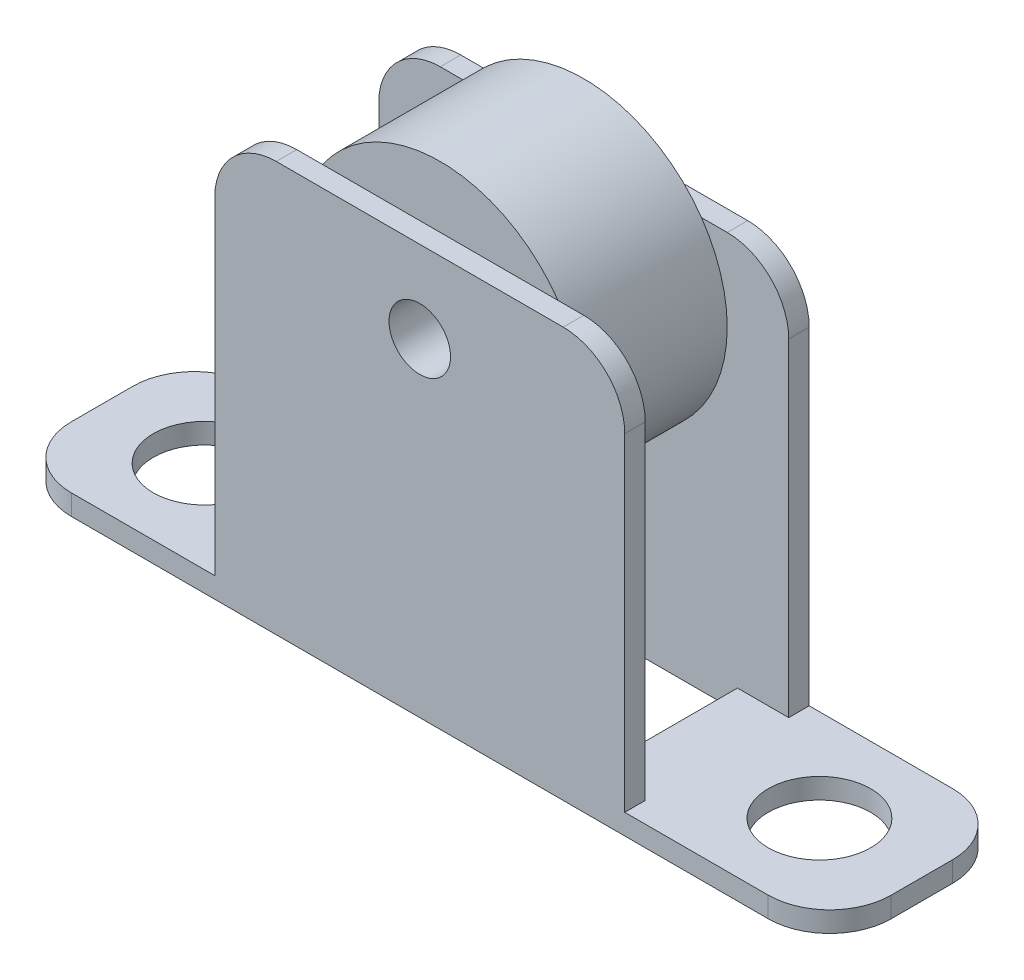
ISO-10303-21;
HEADER;
FILE_DESCRIPTION(('STEP AP214'),'2;1');
FILE_NAME('part.step','',(''),(''),'','','');
FILE_SCHEMA(('AUTOMOTIVE_DESIGN { 1 0 10303 214 1 1 1 1 }'));
ENDSEC;
DATA;
#1=APPLICATION_CONTEXT('core data for automotive mechanical design processes');
#2=APPLICATION_PROTOCOL_DEFINITION('international standard','automotive_design',2000,#1);
#3=PRODUCT_CONTEXT('',#1,'mechanical');
#4=PRODUCT('Part','Part','',(#3));
#5=PRODUCT_RELATED_PRODUCT_CATEGORY('part','',(#4));
#6=PRODUCT_DEFINITION_FORMATION('','',#4);
#7=PRODUCT_DEFINITION_CONTEXT('part definition',#1,'design');
#8=PRODUCT_DEFINITION('design','',#6,#7);
#9=PRODUCT_DEFINITION_SHAPE('','',#8);
#10=(LENGTH_UNIT() NAMED_UNIT(*) SI_UNIT(.MILLI.,.METRE.));
#11=(NAMED_UNIT(*) PLANE_ANGLE_UNIT() SI_UNIT($,.RADIAN.));
#12=(NAMED_UNIT(*) SI_UNIT($,.STERADIAN.) SOLID_ANGLE_UNIT());
#13=UNCERTAINTY_MEASURE_WITH_UNIT(LENGTH_MEASURE(1.E-05),#10,'distance_accuracy_value','');
#14=(GEOMETRIC_REPRESENTATION_CONTEXT(3) GLOBAL_UNCERTAINTY_ASSIGNED_CONTEXT((#13)) GLOBAL_UNIT_ASSIGNED_CONTEXT((#10,
#11,#12)) REPRESENTATION_CONTEXT('',''));
#15=CARTESIAN_POINT('',(0.,0.,0.));
#16=DIRECTION('',(0.,0.,1.));
#17=DIRECTION('',(1.,0.,0.));
#18=AXIS2_PLACEMENT_3D('',#15,#16,#17);
#19=CARTESIAN_POINT('',(12.5,1.,-0.999999999999999));
#20=DIRECTION('',(0.,0.,-1.));
#21=DIRECTION('',(-1.,0.,0.));
#22=AXIS2_PLACEMENT_3D('',#19,#20,#21);
#23=PLANE('',#22);
#24=DIRECTION('',(-1.,0.,0.));
#25=VECTOR('',#24,1.);
#26=CARTESIAN_POINT('',(10.,20.,-1.));
#27=LINE('',#26,#25);
#28=CARTESIAN_POINT('',(27.,20.,-1.));
#29=VERTEX_POINT('',#28);
#30=CARTESIAN_POINT('',(25.744562646538,20.,-1.));
#31=VERTEX_POINT('',#30);
#32=EDGE_CURVE('E290',#29,#31,#27,.T.);
#33=ORIENTED_EDGE('',*,*,#32,.F.);
#34=CARTESIAN_POINT('',(27.,17.,-0.999999999999999));
#35=DIRECTION('',(0.,0.,-1.));
#36=DIRECTION('',(-1.,0.,0.));
#37=AXIS2_PLACEMENT_3D('',#34,#35,#36);
#38=CIRCLE('',#37,3.);
#39=CARTESIAN_POINT('',(30.,17.,-1.));
#40=VERTEX_POINT('',#39);
#41=EDGE_CURVE('E412',#29,#40,#38,.T.);
#42=ORIENTED_EDGE('',*,*,#41,.T.);
#43=DIRECTION('',(0.,1.,0.));
#44=VECTOR('',#43,1.);
#45=CARTESIAN_POINT('',(30.,0.,-1.));
#46=LINE('',#45,#44);
#47=CARTESIAN_POINT('',(30.,1.,-1.));
#48=VERTEX_POINT('',#47);
#49=EDGE_CURVE('E284',#48,#40,#46,.T.);
#50=ORIENTED_EDGE('',*,*,#49,.F.);
#51=DIRECTION('',(1.,0.,0.));
#52=VECTOR('',#51,1.);
#53=CARTESIAN_POINT('',(0.,1.,-1.));
#54=LINE('',#53,#52);
#55=CARTESIAN_POINT('',(27.5,1.,-0.999999999999999));
#56=VERTEX_POINT('',#55);
#57=EDGE_CURVE('E288',#56,#48,#54,.T.);
#58=ORIENTED_EDGE('',*,*,#57,.F.);
#59=DIRECTION('',(0.,-1.,0.));
#60=VECTOR('',#59,1.);
#61=CARTESIAN_POINT('',(27.5,1.,-0.999999999999999));
#62=LINE('',#61,#60);
#63=CARTESIAN_POINT('',(27.5,0.,-0.999999999999999));
#64=VERTEX_POINT('',#63);
#65=EDGE_CURVE('E327',#56,#64,#62,.T.);
#66=ORIENTED_EDGE('',*,*,#65,.T.);
#67=DIRECTION('',(1.,0.,0.));
#68=VECTOR('',#67,1.);
#69=CARTESIAN_POINT('',(12.5,0.,-0.999999999999999));
#70=LINE('',#69,#68);
#71=CARTESIAN_POINT('',(12.5,0.,-0.999999999999999));
#72=VERTEX_POINT('',#71);
#73=EDGE_CURVE('E316',#72,#64,#70,.T.);
#74=ORIENTED_EDGE('',*,*,#73,.F.);
#75=DIRECTION('',(0.,-1.,0.));
#76=VECTOR('',#75,1.);
#77=CARTESIAN_POINT('',(12.5,1.,-0.999999999999999));
#78=LINE('',#77,#76);
#79=CARTESIAN_POINT('',(12.5,1.,-0.999999999999999));
#80=VERTEX_POINT('',#79);
#81=EDGE_CURVE('E329',#80,#72,#78,.T.);
#82=ORIENTED_EDGE('',*,*,#81,.F.);
#83=CARTESIAN_POINT('',(10.,1.,-1.));
#84=VERTEX_POINT('',#83);
#85=EDGE_CURVE('E300',#84,#80,#54,.T.);
#86=ORIENTED_EDGE('',*,*,#85,.F.);
#87=DIRECTION('',(0.,-1.,0.));
#88=VECTOR('',#87,1.);
#89=CARTESIAN_POINT('',(10.,0.,-1.));
#90=LINE('',#89,#88);
#91=CARTESIAN_POINT('',(10.,17.,-1.));
#92=VERTEX_POINT('',#91);
#93=EDGE_CURVE('E278',#92,#84,#90,.T.);
#94=ORIENTED_EDGE('',*,*,#93,.F.);
#95=CARTESIAN_POINT('',(13.,17.,-0.999999999999999));
#96=DIRECTION('',(0.,0.,-1.));
#97=DIRECTION('',(-1.,0.,0.));
#98=AXIS2_PLACEMENT_3D('',#95,#96,#97);
#99=CIRCLE('',#98,3.);
#100=CARTESIAN_POINT('',(13.,20.,-1.));
#101=VERTEX_POINT('',#100);
#102=EDGE_CURVE('E415',#92,#101,#99,.T.);
#103=ORIENTED_EDGE('',*,*,#102,.T.);
#104=CARTESIAN_POINT('',(14.255437353462,20.,-1.));
#105=VERTEX_POINT('',#104);
#106=EDGE_CURVE('E286',#105,#101,#27,.T.);
#107=ORIENTED_EDGE('',*,*,#106,.F.);
#108=CARTESIAN_POINT('',(20.,16.,-1.));
#109=DIRECTION('',(0.,0.,-1.));
#110=DIRECTION('',(-1.,0.,0.));
#111=AXIS2_PLACEMENT_3D('',#108,#109,#110);
#112=CIRCLE('',#111,7.);
#113=EDGE_CURVE('E245',#31,#105,#112,.T.);
#114=ORIENTED_EDGE('',*,*,#113,.F.);
#115=EDGE_LOOP('',(#33,#42,#50,#58,#66,#74,#82,#86,#94,#103,#107,#114));
#116=FACE_BOUND('',#115,.T.);
#117=ADVANCED_FACE('F41',(#116),#23,.T.);
#118=CARTESIAN_POINT('',(12.5,1.,-8.));
#119=DIRECTION('',(0.,0.,1.));
#120=DIRECTION('',(1.,0.,0.));
#121=AXIS2_PLACEMENT_3D('',#118,#119,#120);
#122=PLANE('',#121);
#123=DIRECTION('',(0.,1.,0.));
#124=VECTOR('',#123,1.);
#125=CARTESIAN_POINT('',(30.,1.,-8.));
#126=LINE('',#125,#124);
#127=CARTESIAN_POINT('',(30.,1.,-8.));
#128=VERTEX_POINT('',#127);
#129=CARTESIAN_POINT('',(30.,17.,-8.));
#130=VERTEX_POINT('',#129);
#131=EDGE_CURVE('E227',#128,#130,#126,.T.);
#132=ORIENTED_EDGE('',*,*,#131,.T.);
#133=CARTESIAN_POINT('',(27.,17.,-8.));
#134=DIRECTION('',(0.,0.,1.));
#135=DIRECTION('',(1.,0.,0.));
#136=AXIS2_PLACEMENT_3D('',#133,#134,#135);
#137=CIRCLE('',#136,3.);
#138=CARTESIAN_POINT('',(27.,20.,-8.));
#139=VERTEX_POINT('',#138);
#140=EDGE_CURVE('E421',#130,#139,#137,.T.);
#141=ORIENTED_EDGE('',*,*,#140,.T.);
#142=DIRECTION('',(-1.,0.,0.));
#143=VECTOR('',#142,1.);
#144=CARTESIAN_POINT('',(0.,20.,-8.));
#145=LINE('',#144,#143);
#146=CARTESIAN_POINT('',(25.744562646538,20.,-8.));
#147=VERTEX_POINT('',#146);
#148=EDGE_CURVE('E223',#139,#147,#145,.T.);
#149=ORIENTED_EDGE('',*,*,#148,.T.);
#150=CARTESIAN_POINT('',(20.,16.,-8.));
#151=DIRECTION('',(0.,0.,1.));
#152=DIRECTION('',(1.,0.,0.));
#153=AXIS2_PLACEMENT_3D('',#150,#151,#152);
#154=CIRCLE('',#153,7.);
#155=CARTESIAN_POINT('',(14.255437353462,20.,-8.));
#156=VERTEX_POINT('',#155);
#157=EDGE_CURVE('E230',#156,#147,#154,.T.);
#158=ORIENTED_EDGE('',*,*,#157,.F.);
#159=CARTESIAN_POINT('',(13.,20.,-8.));
#160=VERTEX_POINT('',#159);
#161=EDGE_CURVE('E214',#156,#160,#145,.T.);
#162=ORIENTED_EDGE('',*,*,#161,.T.);
#163=CARTESIAN_POINT('',(13.,17.,-8.));
#164=DIRECTION('',(0.,0.,1.));
#165=DIRECTION('',(1.,0.,0.));
#166=AXIS2_PLACEMENT_3D('',#163,#164,#165);
#167=CIRCLE('',#166,3.);
#168=CARTESIAN_POINT('',(10.,17.,-8.));
#169=VERTEX_POINT('',#168);
#170=EDGE_CURVE('E57',#160,#169,#167,.T.);
#171=ORIENTED_EDGE('',*,*,#170,.T.);
#172=DIRECTION('',(0.,-1.,0.));
#173=VECTOR('',#172,1.);
#174=CARTESIAN_POINT('',(10.,1.,-8.));
#175=LINE('',#174,#173);
#176=CARTESIAN_POINT('',(10.,1.,-8.));
#177=VERTEX_POINT('',#176);
#178=EDGE_CURVE('E259',#169,#177,#175,.T.);
#179=ORIENTED_EDGE('',*,*,#178,.T.);
#180=DIRECTION('',(-1.,0.,0.));
#181=VECTOR('',#180,1.);
#182=CARTESIAN_POINT('',(0.,1.,-8.));
#183=LINE('',#182,#181);
#184=CARTESIAN_POINT('',(12.5,1.,-8.));
#185=VERTEX_POINT('',#184);
#186=EDGE_CURVE('E263',#185,#177,#183,.T.);
#187=ORIENTED_EDGE('',*,*,#186,.F.);
#188=DIRECTION('',(0.,-1.,0.));
#189=VECTOR('',#188,1.);
#190=CARTESIAN_POINT('',(12.5,1.,-8.));
#191=LINE('',#190,#189);
#192=CARTESIAN_POINT('',(12.5,0.,-8.));
#193=VERTEX_POINT('',#192);
#194=EDGE_CURVE('E311',#185,#193,#191,.T.);
#195=ORIENTED_EDGE('',*,*,#194,.T.);
#196=DIRECTION('',(-1.,0.,0.));
#197=VECTOR('',#196,1.);
#198=CARTESIAN_POINT('',(12.5,0.,-8.));
#199=LINE('',#198,#197);
#200=CARTESIAN_POINT('',(27.5,0.,-8.));
#201=VERTEX_POINT('',#200);
#202=EDGE_CURVE('E309',#201,#193,#199,.T.);
#203=ORIENTED_EDGE('',*,*,#202,.F.);
#204=DIRECTION('',(0.,-1.,0.));
#205=VECTOR('',#204,1.);
#206=CARTESIAN_POINT('',(27.5,1.,-8.));
#207=LINE('',#206,#205);
#208=CARTESIAN_POINT('',(27.5,1.,-8.));
#209=VERTEX_POINT('',#208);
#210=EDGE_CURVE('E326',#209,#201,#207,.T.);
#211=ORIENTED_EDGE('',*,*,#210,.F.);
#212=EDGE_CURVE('E268',#128,#209,#183,.T.);
#213=ORIENTED_EDGE('',*,*,#212,.F.);
#214=EDGE_LOOP('',(#132,#141,#149,#158,#162,#171,#179,#187,#195,#203,#211,#213));
#215=FACE_BOUND('',#214,.T.);
#216=ADVANCED_FACE('F226',(#215),#122,.T.);
#217=CARTESIAN_POINT('',(0.,1.,0.));
#218=DIRECTION('',(0.,-1.,0.));
#219=DIRECTION('',(0.,0.,-1.));
#220=AXIS2_PLACEMENT_3D('',#217,#218,#219);
#221=PLANE('',#220);
#222=CARTESIAN_POINT('',(5.,1.,-4.5));
#223=DIRECTION('',(0.,1.,0.));
#224=DIRECTION('',(0.,0.,1.));
#225=AXIS2_PLACEMENT_3D('',#222,#223,#224);
#226=CIRCLE('',#225,2.5);
#227=CARTESIAN_POINT('',(5.,1.,-2.));
#228=VERTEX_POINT('',#227);
#229=EDGE_CURVE('E246',#228,#228,#226,.T.);
#230=ORIENTED_EDGE('',*,*,#229,.F.);
#231=EDGE_LOOP('',(#230));
#232=FACE_BOUND('',#231,.T.);
#233=DIRECTION('',(-1.,0.,0.));
#234=VECTOR('',#233,1.);
#235=CARTESIAN_POINT('',(0.,1.,-9.));
#236=LINE('',#235,#234);
#237=CARTESIAN_POINT('',(10.,1.,-9.));
#238=VERTEX_POINT('',#237);
#239=CARTESIAN_POINT('',(3.,1.,-9.));
#240=VERTEX_POINT('',#239);
#241=EDGE_CURVE('E343',#238,#240,#236,.T.);
#242=ORIENTED_EDGE('',*,*,#241,.T.);
#243=CARTESIAN_POINT('',(3.,1.,-6.));
#244=DIRECTION('',(0.,-1.,0.));
#245=DIRECTION('',(0.,0.,-1.));
#246=AXIS2_PLACEMENT_3D('',#243,#244,#245);
#247=CIRCLE('',#246,3.);
#248=CARTESIAN_POINT('',(0.,1.,-6.));
#249=VERTEX_POINT('',#248);
#250=EDGE_CURVE('E401',#240,#249,#247,.F.);
#251=ORIENTED_EDGE('',*,*,#250,.T.);
#252=DIRECTION('',(0.,0.,1.));
#253=VECTOR('',#252,1.);
#254=CARTESIAN_POINT('',(0.,1.,0.));
#255=LINE('',#254,#253);
#256=CARTESIAN_POINT('',(0.,1.,-3.));
#257=VERTEX_POINT('',#256);
#258=EDGE_CURVE('E331',#249,#257,#255,.T.);
#259=ORIENTED_EDGE('',*,*,#258,.T.);
#260=CARTESIAN_POINT('',(3.,1.,-3.));
#261=DIRECTION('',(0.,-1.,0.));
#262=DIRECTION('',(0.,0.,-1.));
#263=AXIS2_PLACEMENT_3D('',#260,#261,#262);
#264=CIRCLE('',#263,3.);
#265=CARTESIAN_POINT('',(3.,1.,0.));
#266=VERTEX_POINT('',#265);
#267=EDGE_CURVE('E402',#257,#266,#264,.F.);
#268=ORIENTED_EDGE('',*,*,#267,.T.);
#269=DIRECTION('',(1.,0.,0.));
#270=VECTOR('',#269,1.);
#271=CARTESIAN_POINT('',(0.,1.,0.));
#272=LINE('',#271,#270);
#273=CARTESIAN_POINT('',(10.,1.,0.));
#274=VERTEX_POINT('',#273);
#275=EDGE_CURVE('E336',#266,#274,#272,.T.);
#276=ORIENTED_EDGE('',*,*,#275,.T.);
#277=DIRECTION('',(0.,0.,-1.));
#278=VECTOR('',#277,1.);
#279=CARTESIAN_POINT('',(10.,1.,0.));
#280=LINE('',#279,#278);
#281=EDGE_CURVE('E301',#274,#84,#280,.T.);
#282=ORIENTED_EDGE('',*,*,#281,.T.);
#283=ORIENTED_EDGE('',*,*,#85,.T.);
#284=DIRECTION('',(0.,0.,1.));
#285=VECTOR('',#284,1.);
#286=CARTESIAN_POINT('',(12.5,1.,-8.));
#287=LINE('',#286,#285);
#288=EDGE_CURVE('E308',#185,#80,#287,.T.);
#289=ORIENTED_EDGE('',*,*,#288,.F.);
#290=ORIENTED_EDGE('',*,*,#186,.T.);
#291=DIRECTION('',(0.,0.,1.));
#292=VECTOR('',#291,1.);
#293=CARTESIAN_POINT('',(10.,1.,0.));
#294=LINE('',#293,#292);
#295=EDGE_CURVE('E272',#238,#177,#294,.T.);
#296=ORIENTED_EDGE('',*,*,#295,.F.);
#297=EDGE_LOOP('',(#242,#251,#259,#268,#276,#282,#283,#289,#290,#296));
#298=FACE_BOUND('',#297,.T.);
#299=ADVANCED_FACE('F442',(#232,#298),#221,.F.);
#300=CARTESIAN_POINT('',(35.,1.,-4.5));
#301=DIRECTION('',(0.,1.,0.));
#302=DIRECTION('',(0.,0.,1.));
#303=AXIS2_PLACEMENT_3D('',#300,#301,#302);
#304=CIRCLE('',#303,2.5);
#305=CARTESIAN_POINT('',(35.,1.,-2.));
#306=VERTEX_POINT('',#305);
#307=EDGE_CURVE('E253',#306,#306,#304,.T.);
#308=ORIENTED_EDGE('',*,*,#307,.F.);
#309=EDGE_LOOP('',(#308));
#310=FACE_BOUND('',#309,.T.);
#311=CARTESIAN_POINT('',(30.,1.,0.));
#312=VERTEX_POINT('',#311);
#313=CARTESIAN_POINT('',(37.,1.,0.));
#314=VERTEX_POINT('',#313);
#315=EDGE_CURVE('E339',#312,#314,#272,.T.);
#316=ORIENTED_EDGE('',*,*,#315,.T.);
#317=CARTESIAN_POINT('',(37.,1.,-3.));
#318=DIRECTION('',(0.,-1.,0.));
#319=DIRECTION('',(0.,0.,-1.));
#320=AXIS2_PLACEMENT_3D('',#317,#318,#319);
#321=CIRCLE('',#320,3.);
#322=CARTESIAN_POINT('',(40.,1.,-3.));
#323=VERTEX_POINT('',#322);
#324=EDGE_CURVE('E384',#314,#323,#321,.F.);
#325=ORIENTED_EDGE('',*,*,#324,.T.);
#326=DIRECTION('',(0.,0.,-1.));
#327=VECTOR('',#326,1.);
#328=CARTESIAN_POINT('',(40.,1.,0.));
#329=LINE('',#328,#327);
#330=CARTESIAN_POINT('',(40.,1.,-6.));
#331=VERTEX_POINT('',#330);
#332=EDGE_CURVE('E341',#323,#331,#329,.T.);
#333=ORIENTED_EDGE('',*,*,#332,.T.);
#334=CARTESIAN_POINT('',(37.,1.,-6.));
#335=DIRECTION('',(0.,-1.,0.));
#336=DIRECTION('',(0.,0.,-1.));
#337=AXIS2_PLACEMENT_3D('',#334,#335,#336);
#338=CIRCLE('',#337,3.);
#339=CARTESIAN_POINT('',(37.,1.,-9.));
#340=VERTEX_POINT('',#339);
#341=EDGE_CURVE('E382',#331,#340,#338,.F.);
#342=ORIENTED_EDGE('',*,*,#341,.T.);
#343=CARTESIAN_POINT('',(30.,1.,-9.));
#344=VERTEX_POINT('',#343);
#345=EDGE_CURVE('E344',#340,#344,#236,.T.);
#346=ORIENTED_EDGE('',*,*,#345,.T.);
#347=DIRECTION('',(0.,0.,-1.));
#348=VECTOR('',#347,1.);
#349=CARTESIAN_POINT('',(30.,1.,0.));
#350=LINE('',#349,#348);
#351=EDGE_CURVE('E269',#128,#344,#350,.T.);
#352=ORIENTED_EDGE('',*,*,#351,.F.);
#353=ORIENTED_EDGE('',*,*,#212,.T.);
#354=DIRECTION('',(0.,0.,-1.));
#355=VECTOR('',#354,1.);
#356=CARTESIAN_POINT('',(27.5,1.,-8.));
#357=LINE('',#356,#355);
#358=EDGE_CURVE('E310',#56,#209,#357,.T.);
#359=ORIENTED_EDGE('',*,*,#358,.F.);
#360=ORIENTED_EDGE('',*,*,#57,.T.);
#361=DIRECTION('',(0.,0.,1.));
#362=VECTOR('',#361,1.);
#363=CARTESIAN_POINT('',(30.,1.,0.));
#364=LINE('',#363,#362);
#365=EDGE_CURVE('E296',#48,#312,#364,.T.);
#366=ORIENTED_EDGE('',*,*,#365,.T.);
#367=EDGE_LOOP('',(#316,#325,#333,#342,#346,#352,#353,#359,#360,#366));
#368=FACE_BOUND('',#367,.T.);
#369=ADVANCED_FACE('F487',(#310,#368),#221,.F.);
#370=CARTESIAN_POINT('',(0.,0.,0.));
#371=DIRECTION('',(0.,-1.,0.));
#372=DIRECTION('',(0.,0.,-1.));
#373=AXIS2_PLACEMENT_3D('',#370,#371,#372);
#374=PLANE('',#373);
#375=CARTESIAN_POINT('',(5.,0.,-4.5));
#376=DIRECTION('',(0.,-1.,0.));
#377=DIRECTION('',(0.,0.,-1.));
#378=AXIS2_PLACEMENT_3D('',#375,#376,#377);
#379=CIRCLE('',#378,2.5);
#380=CARTESIAN_POINT('',(5.,0.,-7.));
#381=VERTEX_POINT('',#380);
#382=EDGE_CURVE('E247',#381,#381,#379,.T.);
#383=ORIENTED_EDGE('',*,*,#382,.F.);
#384=EDGE_LOOP('',(#383));
#385=FACE_BOUND('',#384,.T.);
#386=CARTESIAN_POINT('',(35.,0.,-4.5));
#387=DIRECTION('',(0.,-1.,0.));
#388=DIRECTION('',(0.,0.,-1.));
#389=AXIS2_PLACEMENT_3D('',#386,#387,#388);
#390=CIRCLE('',#389,2.5);
#391=CARTESIAN_POINT('',(35.,0.,-7.));
#392=VERTEX_POINT('',#391);
#393=EDGE_CURVE('E255',#392,#392,#390,.T.);
#394=ORIENTED_EDGE('',*,*,#393,.F.);
#395=EDGE_LOOP('',(#394));
#396=FACE_BOUND('',#395,.T.);
#397=DIRECTION('',(0.,0.,-1.));
#398=VECTOR('',#397,1.);
#399=CARTESIAN_POINT('',(27.5,0.,-8.));
#400=LINE('',#399,#398);
#401=EDGE_CURVE('E317',#64,#201,#400,.T.);
#402=ORIENTED_EDGE('',*,*,#401,.T.);
#403=ORIENTED_EDGE('',*,*,#202,.T.);
#404=DIRECTION('',(0.,0.,1.));
#405=VECTOR('',#404,1.);
#406=CARTESIAN_POINT('',(12.5,0.,-8.));
#407=LINE('',#406,#405);
#408=EDGE_CURVE('E302',#193,#72,#407,.T.);
#409=ORIENTED_EDGE('',*,*,#408,.T.);
#410=ORIENTED_EDGE('',*,*,#73,.T.);
#411=EDGE_LOOP('',(#402,#403,#409,#410));
#412=FACE_BOUND('',#411,.T.);
#413=DIRECTION('',(0.,0.,-1.));
#414=VECTOR('',#413,1.);
#415=CARTESIAN_POINT('',(40.,0.,0.));
#416=LINE('',#415,#414);
#417=CARTESIAN_POINT('',(40.,0.,-3.));
#418=VERTEX_POINT('',#417);
#419=CARTESIAN_POINT('',(40.,0.,-6.));
#420=VERTEX_POINT('',#419);
#421=EDGE_CURVE('E355',#418,#420,#416,.T.);
#422=ORIENTED_EDGE('',*,*,#421,.F.);
#423=CARTESIAN_POINT('',(37.,0.,-3.));
#424=DIRECTION('',(0.,-1.,0.));
#425=DIRECTION('',(0.,0.,-1.));
#426=AXIS2_PLACEMENT_3D('',#423,#424,#425);
#427=CIRCLE('',#426,3.);
#428=CARTESIAN_POINT('',(37.,0.,0.));
#429=VERTEX_POINT('',#428);
#430=EDGE_CURVE('E375',#418,#429,#427,.T.);
#431=ORIENTED_EDGE('',*,*,#430,.T.);
#432=DIRECTION('',(1.,0.,0.));
#433=VECTOR('',#432,1.);
#434=CARTESIAN_POINT('',(0.,0.,0.));
#435=LINE('',#434,#433);
#436=CARTESIAN_POINT('',(3.,0.,0.));
#437=VERTEX_POINT('',#436);
#438=EDGE_CURVE('E348',#437,#429,#435,.T.);
#439=ORIENTED_EDGE('',*,*,#438,.F.);
#440=CARTESIAN_POINT('',(3.,0.,-3.));
#441=DIRECTION('',(0.,-1.,0.));
#442=DIRECTION('',(0.,0.,-1.));
#443=AXIS2_PLACEMENT_3D('',#440,#441,#442);
#444=CIRCLE('',#443,3.);
#445=CARTESIAN_POINT('',(0.,0.,-3.));
#446=VERTEX_POINT('',#445);
#447=EDGE_CURVE('E368',#437,#446,#444,.T.);
#448=ORIENTED_EDGE('',*,*,#447,.T.);
#449=DIRECTION('',(0.,0.,1.));
#450=VECTOR('',#449,1.);
#451=CARTESIAN_POINT('',(0.,0.,0.));
#452=LINE('',#451,#450);
#453=CARTESIAN_POINT('',(0.,0.,-6.));
#454=VERTEX_POINT('',#453);
#455=EDGE_CURVE('E334',#454,#446,#452,.T.);
#456=ORIENTED_EDGE('',*,*,#455,.F.);
#457=CARTESIAN_POINT('',(3.,0.,-6.));
#458=DIRECTION('',(0.,-1.,0.));
#459=DIRECTION('',(0.,0.,-1.));
#460=AXIS2_PLACEMENT_3D('',#457,#458,#459);
#461=CIRCLE('',#460,3.);
#462=CARTESIAN_POINT('',(3.,0.,-9.));
#463=VERTEX_POINT('',#462);
#464=EDGE_CURVE('E366',#454,#463,#461,.T.);
#465=ORIENTED_EDGE('',*,*,#464,.T.);
#466=DIRECTION('',(-1.,0.,0.));
#467=VECTOR('',#466,1.);
#468=CARTESIAN_POINT('',(0.,0.,-9.));
#469=LINE('',#468,#467);
#470=CARTESIAN_POINT('',(37.,0.,-9.));
#471=VERTEX_POINT('',#470);
#472=EDGE_CURVE('E340',#471,#463,#469,.T.);
#473=ORIENTED_EDGE('',*,*,#472,.F.);
#474=CARTESIAN_POINT('',(37.,0.,-6.));
#475=DIRECTION('',(0.,-1.,0.));
#476=DIRECTION('',(0.,0.,-1.));
#477=AXIS2_PLACEMENT_3D('',#474,#475,#476);
#478=CIRCLE('',#477,3.);
#479=EDGE_CURVE('E367',#471,#420,#478,.T.);
#480=ORIENTED_EDGE('',*,*,#479,.T.);
#481=EDGE_LOOP('',(#422,#431,#439,#448,#456,#465,#473,#480));
#482=FACE_BOUND('',#481,.T.);
#483=ADVANCED_FACE('F452',(#385,#396,#412,#482),#374,.T.);
#484=CARTESIAN_POINT('',(0.,1.,0.));
#485=DIRECTION('',(1.,0.,0.));
#486=DIRECTION('',(0.,0.,-1.));
#487=AXIS2_PLACEMENT_3D('',#484,#485,#486);
#488=PLANE('',#487);
#489=ORIENTED_EDGE('',*,*,#258,.F.);
#490=DIRECTION('',(0.,-1.,0.));
#491=VECTOR('',#490,1.);
#492=CARTESIAN_POINT('',(0.,1.,-6.));
#493=LINE('',#492,#491);
#494=EDGE_CURVE('E397',#249,#454,#493,.T.);
#495=ORIENTED_EDGE('',*,*,#494,.T.);
#496=ORIENTED_EDGE('',*,*,#455,.T.);
#497=DIRECTION('',(0.,-1.,0.));
#498=VECTOR('',#497,1.);
#499=CARTESIAN_POINT('',(0.,1.,-3.));
#500=LINE('',#499,#498);
#501=EDGE_CURVE('E396',#446,#257,#500,.F.);
#502=ORIENTED_EDGE('',*,*,#501,.T.);
#503=EDGE_LOOP('',(#489,#495,#496,#502));
#504=FACE_BOUND('',#503,.T.);
#505=ADVANCED_FACE('F446',(#504),#488,.F.);
#506=CARTESIAN_POINT('',(0.,1.,0.));
#507=DIRECTION('',(0.,0.,-1.));
#508=DIRECTION('',(-1.,0.,0.));
#509=AXIS2_PLACEMENT_3D('',#506,#507,#508);
#510=PLANE('',#509);
#511=ORIENTED_EDGE('',*,*,#438,.T.);
#512=DIRECTION('',(0.,-1.,0.));
#513=VECTOR('',#512,1.);
#514=CARTESIAN_POINT('',(37.,1.,0.));
#515=LINE('',#514,#513);
#516=EDGE_CURVE('E381',#429,#314,#515,.F.);
#517=ORIENTED_EDGE('',*,*,#516,.T.);
#518=ORIENTED_EDGE('',*,*,#315,.F.);
#519=DIRECTION('',(0.,1.,0.));
#520=VECTOR('',#519,1.);
#521=CARTESIAN_POINT('',(30.,0.,0.));
#522=LINE('',#521,#520);
#523=CARTESIAN_POINT('',(30.,17.,0.));
#524=VERTEX_POINT('',#523);
#525=EDGE_CURVE('E295',#312,#524,#522,.T.);
#526=ORIENTED_EDGE('',*,*,#525,.T.);
#527=CARTESIAN_POINT('',(27.,17.,0.));
#528=DIRECTION('',(0.,0.,-1.));
#529=DIRECTION('',(-1.,0.,0.));
#530=AXIS2_PLACEMENT_3D('',#527,#528,#529);
#531=CIRCLE('',#530,3.);
#532=CARTESIAN_POINT('',(27.,20.,0.));
#533=VERTEX_POINT('',#532);
#534=EDGE_CURVE('E376',#524,#533,#531,.F.);
#535=ORIENTED_EDGE('',*,*,#534,.T.);
#536=DIRECTION('',(-1.,0.,0.));
#537=VECTOR('',#536,1.);
#538=CARTESIAN_POINT('',(10.,20.,0.));
#539=LINE('',#538,#537);
#540=CARTESIAN_POINT('',(13.,20.,0.));
#541=VERTEX_POINT('',#540);
#542=EDGE_CURVE('E285',#533,#541,#539,.T.);
#543=ORIENTED_EDGE('',*,*,#542,.T.);
#544=CARTESIAN_POINT('',(13.,17.,0.));
#545=DIRECTION('',(0.,0.,-1.));
#546=DIRECTION('',(-1.,0.,0.));
#547=AXIS2_PLACEMENT_3D('',#544,#545,#546);
#548=CIRCLE('',#547,3.);
#549=CARTESIAN_POINT('',(10.,17.,0.));
#550=VERTEX_POINT('',#549);
#551=EDGE_CURVE('E372',#541,#550,#548,.F.);
#552=ORIENTED_EDGE('',*,*,#551,.T.);
#553=DIRECTION('',(0.,-1.,0.));
#554=VECTOR('',#553,1.);
#555=CARTESIAN_POINT('',(10.,0.,0.));
#556=LINE('',#555,#554);
#557=EDGE_CURVE('E276',#550,#274,#556,.T.);
#558=ORIENTED_EDGE('',*,*,#557,.T.);
#559=ORIENTED_EDGE('',*,*,#275,.F.);
#560=DIRECTION('',(0.,-1.,0.));
#561=VECTOR('',#560,1.);
#562=CARTESIAN_POINT('',(3.,1.,0.));
#563=LINE('',#562,#561);
#564=EDGE_CURVE('E378',#266,#437,#563,.T.);
#565=ORIENTED_EDGE('',*,*,#564,.T.);
#566=EDGE_LOOP('',(#511,#517,#518,#526,#535,#543,#552,#558,#559,#565));
#567=FACE_BOUND('',#566,.T.);
#568=CARTESIAN_POINT('',(20.,16.,0.));
#569=DIRECTION('',(0.,0.,1.));
#570=DIRECTION('',(1.,0.,0.));
#571=AXIS2_PLACEMENT_3D('',#568,#569,#570);
#572=CIRCLE('',#571,1.5);
#573=CARTESIAN_POINT('',(21.5,16.,0.));
#574=VERTEX_POINT('',#573);
#575=EDGE_CURVE('E277',#574,#574,#572,.T.);
#576=ORIENTED_EDGE('',*,*,#575,.F.);
#577=EDGE_LOOP('',(#576));
#578=FACE_BOUND('',#577,.T.);
#579=ADVANCED_FACE('F464',(#567,#578),#510,.F.);
#580=CARTESIAN_POINT('',(40.,1.,0.));
#581=DIRECTION('',(-1.,0.,0.));
#582=DIRECTION('',(0.,0.,1.));
#583=AXIS2_PLACEMENT_3D('',#580,#581,#582);
#584=PLANE('',#583);
#585=ORIENTED_EDGE('',*,*,#332,.F.);
#586=DIRECTION('',(0.,-1.,0.));
#587=VECTOR('',#586,1.);
#588=CARTESIAN_POINT('',(40.,1.,-3.));
#589=LINE('',#588,#587);
#590=EDGE_CURVE('E361',#323,#418,#589,.T.);
#591=ORIENTED_EDGE('',*,*,#590,.T.);
#592=ORIENTED_EDGE('',*,*,#421,.T.);
#593=DIRECTION('',(0.,-1.,0.));
#594=VECTOR('',#593,1.);
#595=CARTESIAN_POINT('',(40.,1.,-6.));
#596=LINE('',#595,#594);
#597=EDGE_CURVE('E350',#420,#331,#596,.F.);
#598=ORIENTED_EDGE('',*,*,#597,.T.);
#599=EDGE_LOOP('',(#585,#591,#592,#598));
#600=FACE_BOUND('',#599,.T.);
#601=ADVANCED_FACE('F532',(#600),#584,.F.);
#602=CARTESIAN_POINT('',(0.,1.,-9.));
#603=DIRECTION('',(0.,0.,1.));
#604=DIRECTION('',(1.,0.,0.));
#605=AXIS2_PLACEMENT_3D('',#602,#603,#604);
#606=PLANE('',#605);
#607=ORIENTED_EDGE('',*,*,#345,.F.);
#608=DIRECTION('',(0.,-1.,0.));
#609=VECTOR('',#608,1.);
#610=CARTESIAN_POINT('',(37.,1.,-9.));
#611=LINE('',#610,#609);
#612=EDGE_CURVE('E395',#340,#471,#611,.T.);
#613=ORIENTED_EDGE('',*,*,#612,.T.);
#614=ORIENTED_EDGE('',*,*,#472,.T.);
#615=DIRECTION('',(0.,-1.,0.));
#616=VECTOR('',#615,1.);
#617=CARTESIAN_POINT('',(3.,1.,-9.));
#618=LINE('',#617,#616);
#619=EDGE_CURVE('E392',#463,#240,#618,.F.);
#620=ORIENTED_EDGE('',*,*,#619,.T.);
#621=ORIENTED_EDGE('',*,*,#241,.F.);
#622=DIRECTION('',(0.,-1.,0.));
#623=VECTOR('',#622,1.);
#624=CARTESIAN_POINT('',(10.,1.,-9.));
#625=LINE('',#624,#623);
#626=CARTESIAN_POINT('',(10.,17.,-9.));
#627=VERTEX_POINT('',#626);
#628=EDGE_CURVE('E256',#627,#238,#625,.T.);
#629=ORIENTED_EDGE('',*,*,#628,.F.);
#630=CARTESIAN_POINT('',(13.,17.,-9.));
#631=DIRECTION('',(0.,0.,1.));
#632=DIRECTION('',(1.,0.,0.));
#633=AXIS2_PLACEMENT_3D('',#630,#631,#632);
#634=CIRCLE('',#633,3.);
#635=CARTESIAN_POINT('',(13.,20.,-9.));
#636=VERTEX_POINT('',#635);
#637=EDGE_CURVE('E390',#627,#636,#634,.F.);
#638=ORIENTED_EDGE('',*,*,#637,.T.);
#639=DIRECTION('',(-1.,0.,0.));
#640=VECTOR('',#639,1.);
#641=CARTESIAN_POINT('',(0.,20.,-9.));
#642=LINE('',#641,#640);
#643=CARTESIAN_POINT('',(27.,20.,-9.));
#644=VERTEX_POINT('',#643);
#645=EDGE_CURVE('E261',#644,#636,#642,.T.);
#646=ORIENTED_EDGE('',*,*,#645,.F.);
#647=CARTESIAN_POINT('',(27.,17.,-9.));
#648=DIRECTION('',(0.,0.,1.));
#649=DIRECTION('',(1.,0.,0.));
#650=AXIS2_PLACEMENT_3D('',#647,#648,#649);
#651=CIRCLE('',#650,3.);
#652=CARTESIAN_POINT('',(30.,17.,-9.));
#653=VERTEX_POINT('',#652);
#654=EDGE_CURVE('E386',#644,#653,#651,.F.);
#655=ORIENTED_EDGE('',*,*,#654,.T.);
#656=DIRECTION('',(0.,1.,0.));
#657=VECTOR('',#656,1.);
#658=CARTESIAN_POINT('',(30.,1.,-9.));
#659=LINE('',#658,#657);
#660=EDGE_CURVE('E264',#344,#653,#659,.T.);
#661=ORIENTED_EDGE('',*,*,#660,.F.);
#662=EDGE_LOOP('',(#607,#613,#614,#620,#621,#629,#638,#646,#655,#661));
#663=FACE_BOUND('',#662,.T.);
#664=CARTESIAN_POINT('',(20.,16.,-9.));
#665=DIRECTION('',(0.,0.,1.));
#666=DIRECTION('',(1.,0.,0.));
#667=AXIS2_PLACEMENT_3D('',#664,#665,#666);
#668=CIRCLE('',#667,1.5);
#669=CARTESIAN_POINT('',(21.5,16.,-9.));
#670=VERTEX_POINT('',#669);
#671=EDGE_CURVE('E254',#670,#670,#668,.T.);
#672=ORIENTED_EDGE('',*,*,#671,.T.);
#673=EDGE_LOOP('',(#672));
#674=FACE_BOUND('',#673,.T.);
#675=ADVANCED_FACE('F432',(#663,#674),#606,.F.);
#676=CARTESIAN_POINT('',(12.5,1.,-8.));
#677=DIRECTION('',(1.,0.,0.));
#678=DIRECTION('',(0.,0.,-1.));
#679=AXIS2_PLACEMENT_3D('',#676,#677,#678);
#680=PLANE('',#679);
#681=ORIENTED_EDGE('',*,*,#408,.F.);
#682=ORIENTED_EDGE('',*,*,#194,.F.);
#683=ORIENTED_EDGE('',*,*,#288,.T.);
#684=ORIENTED_EDGE('',*,*,#81,.T.);
#685=EDGE_LOOP('',(#681,#682,#683,#684));
#686=FACE_BOUND('',#685,.T.);
#687=ADVANCED_FACE('F478',(#686),#680,.T.);
#688=CARTESIAN_POINT('',(27.5,1.,-8.));
#689=DIRECTION('',(-1.,0.,0.));
#690=DIRECTION('',(0.,0.,1.));
#691=AXIS2_PLACEMENT_3D('',#688,#689,#690);
#692=PLANE('',#691);
#693=ORIENTED_EDGE('',*,*,#401,.F.);
#694=ORIENTED_EDGE('',*,*,#65,.F.);
#695=ORIENTED_EDGE('',*,*,#358,.T.);
#696=ORIENTED_EDGE('',*,*,#210,.T.);
#697=EDGE_LOOP('',(#693,#694,#695,#696));
#698=FACE_BOUND('',#697,.T.);
#699=ADVANCED_FACE('F484',(#698),#692,.T.);
#700=CARTESIAN_POINT('',(10.,0.,-1.));
#701=DIRECTION('',(-1.,0.,0.));
#702=DIRECTION('',(0.,0.,1.));
#703=AXIS2_PLACEMENT_3D('',#700,#701,#702);
#704=PLANE('',#703);
#705=ORIENTED_EDGE('',*,*,#557,.F.);
#706=DIRECTION('',(0.,0.,1.));
#707=VECTOR('',#706,1.);
#708=CARTESIAN_POINT('',(10.,17.,-1.));
#709=LINE('',#708,#707);
#710=EDGE_CURVE('E11',#550,#92,#709,.F.);
#711=ORIENTED_EDGE('',*,*,#710,.T.);
#712=ORIENTED_EDGE('',*,*,#93,.T.);
#713=ORIENTED_EDGE('',*,*,#281,.F.);
#714=EDGE_LOOP('',(#705,#711,#712,#713));
#715=FACE_BOUND('',#714,.T.);
#716=ADVANCED_FACE('F507',(#715),#704,.T.);
#717=CARTESIAN_POINT('',(30.,0.,-1.));
#718=DIRECTION('',(1.,0.,0.));
#719=DIRECTION('',(0.,0.,-1.));
#720=AXIS2_PLACEMENT_3D('',#717,#718,#719);
#721=PLANE('',#720);
#722=ORIENTED_EDGE('',*,*,#49,.T.);
#723=DIRECTION('',(0.,0.,1.));
#724=VECTOR('',#723,1.);
#725=CARTESIAN_POINT('',(30.,17.,-1.));
#726=LINE('',#725,#724);
#727=EDGE_CURVE('E403',#40,#524,#726,.T.);
#728=ORIENTED_EDGE('',*,*,#727,.T.);
#729=ORIENTED_EDGE('',*,*,#525,.F.);
#730=ORIENTED_EDGE('',*,*,#365,.F.);
#731=EDGE_LOOP('',(#722,#728,#729,#730));
#732=FACE_BOUND('',#731,.T.);
#733=ADVANCED_FACE('F494',(#732),#721,.T.);
#734=CARTESIAN_POINT('',(10.,20.,-1.));
#735=DIRECTION('',(0.,1.,0.));
#736=DIRECTION('',(0.,0.,1.));
#737=AXIS2_PLACEMENT_3D('',#734,#735,#736);
#738=PLANE('',#737);
#739=ORIENTED_EDGE('',*,*,#542,.F.);
#740=DIRECTION('',(0.,0.,1.));
#741=VECTOR('',#740,1.);
#742=CARTESIAN_POINT('',(27.,20.,-1.));
#743=LINE('',#742,#741);
#744=EDGE_CURVE('E414',#533,#29,#743,.F.);
#745=ORIENTED_EDGE('',*,*,#744,.T.);
#746=ORIENTED_EDGE('',*,*,#32,.T.);
#747=DIRECTION('',(-1.,0.,0.));
#748=VECTOR('',#747,1.);
#749=CARTESIAN_POINT('',(10.,20.,-1.));
#750=LINE('',#749,#748);
#751=EDGE_CURVE('E236',#31,#105,#750,.T.);
#752=ORIENTED_EDGE('',*,*,#751,.T.);
#753=ORIENTED_EDGE('',*,*,#106,.T.);
#754=DIRECTION('',(0.,0.,1.));
#755=VECTOR('',#754,1.);
#756=CARTESIAN_POINT('',(13.,20.,-1.));
#757=LINE('',#756,#755);
#758=EDGE_CURVE('E410',#101,#541,#757,.T.);
#759=ORIENTED_EDGE('',*,*,#758,.T.);
#760=EDGE_LOOP('',(#739,#745,#746,#752,#753,#759));
#761=FACE_BOUND('',#760,.T.);
#762=ADVANCED_FACE('F504',(#761),#738,.T.);
#763=CARTESIAN_POINT('',(20.,16.,-1.));
#764=DIRECTION('',(0.,0.,1.));
#765=DIRECTION('',(1.,0.,0.));
#766=AXIS2_PLACEMENT_3D('',#763,#764,#765);
#767=CYLINDRICAL_SURFACE('',#766,1.5);
#768=ORIENTED_EDGE('',*,*,#575,.T.);
#769=EDGE_LOOP('',(#768));
#770=FACE_BOUND('',#769,.T.);
#771=ORIENTED_EDGE('',*,*,#671,.F.);
#772=EDGE_LOOP('',(#771));
#773=FACE_BOUND('',#772,.T.);
#774=ADVANCED_FACE('F618',(#770,#773),#767,.F.);
#775=CARTESIAN_POINT('',(10.,1.,-8.));
#776=DIRECTION('',(1.,0.,0.));
#777=DIRECTION('',(0.,0.,-1.));
#778=AXIS2_PLACEMENT_3D('',#775,#776,#777);
#779=PLANE('',#778);
#780=ORIENTED_EDGE('',*,*,#178,.F.);
#781=DIRECTION('',(0.,0.,-1.));
#782=VECTOR('',#781,1.);
#783=CARTESIAN_POINT('',(10.,17.,-8.));
#784=LINE('',#783,#782);
#785=EDGE_CURVE('E47',#169,#627,#784,.T.);
#786=ORIENTED_EDGE('',*,*,#785,.T.);
#787=ORIENTED_EDGE('',*,*,#628,.T.);
#788=ORIENTED_EDGE('',*,*,#295,.T.);
#789=EDGE_LOOP('',(#780,#786,#787,#788));
#790=FACE_BOUND('',#789,.T.);
#791=ADVANCED_FACE('F428',(#790),#779,.F.);
#792=CARTESIAN_POINT('',(30.,1.,-8.));
#793=DIRECTION('',(-1.,0.,0.));
#794=DIRECTION('',(0.,0.,1.));
#795=AXIS2_PLACEMENT_3D('',#792,#793,#794);
#796=PLANE('',#795);
#797=ORIENTED_EDGE('',*,*,#660,.T.);
#798=DIRECTION('',(0.,0.,-1.));
#799=VECTOR('',#798,1.);
#800=CARTESIAN_POINT('',(30.,17.,-8.));
#801=LINE('',#800,#799);
#802=EDGE_CURVE('E61',#653,#130,#801,.F.);
#803=ORIENTED_EDGE('',*,*,#802,.T.);
#804=ORIENTED_EDGE('',*,*,#131,.F.);
#805=ORIENTED_EDGE('',*,*,#351,.T.);
#806=EDGE_LOOP('',(#797,#803,#804,#805));
#807=FACE_BOUND('',#806,.T.);
#808=ADVANCED_FACE('F720',(#807),#796,.F.);
#809=CARTESIAN_POINT('',(0.,20.,-8.));
#810=DIRECTION('',(0.,-1.,0.));
#811=DIRECTION('',(0.,0.,-1.));
#812=AXIS2_PLACEMENT_3D('',#809,#810,#811);
#813=PLANE('',#812);
#814=ORIENTED_EDGE('',*,*,#148,.F.);
#815=DIRECTION('',(0.,0.,-1.));
#816=VECTOR('',#815,1.);
#817=CARTESIAN_POINT('',(27.,20.,-8.));
#818=LINE('',#817,#816);
#819=EDGE_CURVE('E416',#139,#644,#818,.T.);
#820=ORIENTED_EDGE('',*,*,#819,.T.);
#821=ORIENTED_EDGE('',*,*,#645,.T.);
#822=DIRECTION('',(0.,0.,-1.));
#823=VECTOR('',#822,1.);
#824=CARTESIAN_POINT('',(13.,20.,-8.));
#825=LINE('',#824,#823);
#826=EDGE_CURVE('E221',#636,#160,#825,.F.);
#827=ORIENTED_EDGE('',*,*,#826,.T.);
#828=ORIENTED_EDGE('',*,*,#161,.F.);
#829=DIRECTION('',(-1.,0.,0.));
#830=VECTOR('',#829,1.);
#831=CARTESIAN_POINT('',(0.,20.,-8.));
#832=LINE('',#831,#830);
#833=EDGE_CURVE('E219',#147,#156,#832,.T.);
#834=ORIENTED_EDGE('',*,*,#833,.F.);
#835=EDGE_LOOP('',(#814,#820,#821,#827,#828,#834));
#836=FACE_BOUND('',#835,.T.);
#837=ADVANCED_FACE('F217',(#836),#813,.F.);
#838=CARTESIAN_POINT('',(35.,1.,-4.5));
#839=DIRECTION('',(0.,1.,0.));
#840=DIRECTION('',(0.,0.,1.));
#841=AXIS2_PLACEMENT_3D('',#838,#839,#840);
#842=CYLINDRICAL_SURFACE('',#841,2.5);
#843=ORIENTED_EDGE('',*,*,#393,.T.);
#844=EDGE_LOOP('',(#843));
#845=FACE_BOUND('',#844,.T.);
#846=ORIENTED_EDGE('',*,*,#307,.T.);
#847=EDGE_LOOP('',(#846));
#848=FACE_BOUND('',#847,.T.);
#849=ADVANCED_FACE('F635',(#845,#848),#842,.F.);
#850=CARTESIAN_POINT('',(5.,1.,-4.5));
#851=DIRECTION('',(0.,1.,0.));
#852=DIRECTION('',(0.,0.,1.));
#853=AXIS2_PLACEMENT_3D('',#850,#851,#852);
#854=CYLINDRICAL_SURFACE('',#853,2.5);
#855=ORIENTED_EDGE('',*,*,#382,.T.);
#856=EDGE_LOOP('',(#855));
#857=FACE_BOUND('',#856,.T.);
#858=ORIENTED_EDGE('',*,*,#229,.T.);
#859=EDGE_LOOP('',(#858));
#860=FACE_BOUND('',#859,.T.);
#861=ADVANCED_FACE('F613',(#857,#860),#854,.F.);
#862=CARTESIAN_POINT('',(20.,16.,-8.));
#863=DIRECTION('',(0.,0.,1.));
#864=DIRECTION('',(1.,0.,0.));
#865=AXIS2_PLACEMENT_3D('',#862,#863,#864);
#866=PLANE('',#865);
#867=EDGE_CURVE('E232',#147,#156,#154,.T.);
#868=ORIENTED_EDGE('',*,*,#867,.F.);
#869=ORIENTED_EDGE('',*,*,#833,.T.);
#870=EDGE_LOOP('',(#868,#869));
#871=FACE_BOUND('',#870,.T.);
#872=ADVANCED_FACE('F240',(#871),#866,.F.);
#873=CARTESIAN_POINT('',(20.,16.,18.7989898732233));
#874=DIRECTION('',(0.,0.,-1.));
#875=DIRECTION('',(-1.,0.,0.));
#876=AXIS2_PLACEMENT_3D('',#873,#874,#875);
#877=CYLINDRICAL_SURFACE('',#876,7.);
#878=EDGE_CURVE('E233',#105,#31,#112,.T.);
#879=ORIENTED_EDGE('',*,*,#878,.T.);
#880=ORIENTED_EDGE('',*,*,#113,.T.);
#881=EDGE_LOOP('',(#879,#880));
#882=FACE_BOUND('',#881,.T.);
#883=ORIENTED_EDGE('',*,*,#867,.T.);
#884=ORIENTED_EDGE('',*,*,#157,.T.);
#885=EDGE_LOOP('',(#883,#884));
#886=FACE_BOUND('',#885,.T.);
#887=ADVANCED_FACE('F238',(#882,#886),#877,.T.);
#888=CARTESIAN_POINT('',(12.5,1.,-0.999999999999999));
#889=DIRECTION('',(0.,0.,-1.));
#890=DIRECTION('',(-1.,0.,0.));
#891=AXIS2_PLACEMENT_3D('',#888,#889,#890);
#892=PLANE('',#891);
#893=ORIENTED_EDGE('',*,*,#751,.F.);
#894=ORIENTED_EDGE('',*,*,#878,.F.);
#895=EDGE_LOOP('',(#893,#894));
#896=FACE_BOUND('',#895,.T.);
#897=ADVANCED_FACE('F550',(#896),#892,.F.);
#898=CARTESIAN_POINT('',(37.,1.,-3.));
#899=DIRECTION('',(0.,-1.,0.));
#900=DIRECTION('',(0.,0.,-1.));
#901=AXIS2_PLACEMENT_3D('',#898,#899,#900);
#902=CYLINDRICAL_SURFACE('',#901,3.);
#903=ORIENTED_EDGE('',*,*,#324,.F.);
#904=ORIENTED_EDGE('',*,*,#516,.F.);
#905=ORIENTED_EDGE('',*,*,#430,.F.);
#906=ORIENTED_EDGE('',*,*,#590,.F.);
#907=EDGE_LOOP('',(#903,#904,#905,#906));
#908=FACE_BOUND('',#907,.T.);
#909=ADVANCED_FACE('F543',(#908),#902,.T.);
#910=CARTESIAN_POINT('',(37.,1.,-6.));
#911=DIRECTION('',(0.,-1.,0.));
#912=DIRECTION('',(0.,0.,-1.));
#913=AXIS2_PLACEMENT_3D('',#910,#911,#912);
#914=CYLINDRICAL_SURFACE('',#913,3.);
#915=ORIENTED_EDGE('',*,*,#341,.F.);
#916=ORIENTED_EDGE('',*,*,#597,.F.);
#917=ORIENTED_EDGE('',*,*,#479,.F.);
#918=ORIENTED_EDGE('',*,*,#612,.F.);
#919=EDGE_LOOP('',(#915,#916,#917,#918));
#920=FACE_BOUND('',#919,.T.);
#921=ADVANCED_FACE('F546',(#920),#914,.T.);
#922=CARTESIAN_POINT('',(3.,1.,-6.));
#923=DIRECTION('',(0.,-1.,0.));
#924=DIRECTION('',(0.,0.,-1.));
#925=AXIS2_PLACEMENT_3D('',#922,#923,#924);
#926=CYLINDRICAL_SURFACE('',#925,3.);
#927=ORIENTED_EDGE('',*,*,#250,.F.);
#928=ORIENTED_EDGE('',*,*,#619,.F.);
#929=ORIENTED_EDGE('',*,*,#464,.F.);
#930=ORIENTED_EDGE('',*,*,#494,.F.);
#931=EDGE_LOOP('',(#927,#928,#929,#930));
#932=FACE_BOUND('',#931,.T.);
#933=ADVANCED_FACE('F447',(#932),#926,.T.);
#934=CARTESIAN_POINT('',(3.,1.,-3.));
#935=DIRECTION('',(0.,-1.,0.));
#936=DIRECTION('',(0.,0.,-1.));
#937=AXIS2_PLACEMENT_3D('',#934,#935,#936);
#938=CYLINDRICAL_SURFACE('',#937,3.);
#939=ORIENTED_EDGE('',*,*,#267,.F.);
#940=ORIENTED_EDGE('',*,*,#501,.F.);
#941=ORIENTED_EDGE('',*,*,#447,.F.);
#942=ORIENTED_EDGE('',*,*,#564,.F.);
#943=EDGE_LOOP('',(#939,#940,#941,#942));
#944=FACE_BOUND('',#943,.T.);
#945=ADVANCED_FACE('F459',(#944),#938,.T.);
#946=CARTESIAN_POINT('',(27.,17.,-1.));
#947=DIRECTION('',(0.,0.,1.));
#948=DIRECTION('',(1.,0.,0.));
#949=AXIS2_PLACEMENT_3D('',#946,#947,#948);
#950=CYLINDRICAL_SURFACE('',#949,3.);
#951=ORIENTED_EDGE('',*,*,#41,.F.);
#952=ORIENTED_EDGE('',*,*,#744,.F.);
#953=ORIENTED_EDGE('',*,*,#534,.F.);
#954=ORIENTED_EDGE('',*,*,#727,.F.);
#955=EDGE_LOOP('',(#951,#952,#953,#954));
#956=FACE_BOUND('',#955,.T.);
#957=ADVANCED_FACE('F499',(#956),#950,.T.);
#958=CARTESIAN_POINT('',(27.,17.,-8.));
#959=DIRECTION('',(0.,0.,-1.));
#960=DIRECTION('',(-1.,0.,0.));
#961=AXIS2_PLACEMENT_3D('',#958,#959,#960);
#962=CYLINDRICAL_SURFACE('',#961,3.);
#963=ORIENTED_EDGE('',*,*,#140,.F.);
#964=ORIENTED_EDGE('',*,*,#802,.F.);
#965=ORIENTED_EDGE('',*,*,#654,.F.);
#966=ORIENTED_EDGE('',*,*,#819,.F.);
#967=EDGE_LOOP('',(#963,#964,#965,#966));
#968=FACE_BOUND('',#967,.T.);
#969=ADVANCED_FACE('F560',(#968),#962,.T.);
#970=CARTESIAN_POINT('',(13.,17.,-8.));
#971=DIRECTION('',(0.,0.,-1.));
#972=DIRECTION('',(-1.,0.,0.));
#973=AXIS2_PLACEMENT_3D('',#970,#971,#972);
#974=CYLINDRICAL_SURFACE('',#973,3.);
#975=ORIENTED_EDGE('',*,*,#170,.F.);
#976=ORIENTED_EDGE('',*,*,#826,.F.);
#977=ORIENTED_EDGE('',*,*,#637,.F.);
#978=ORIENTED_EDGE('',*,*,#785,.F.);
#979=EDGE_LOOP('',(#975,#976,#977,#978));
#980=FACE_BOUND('',#979,.T.);
#981=ADVANCED_FACE('F558',(#980),#974,.T.);
#982=CARTESIAN_POINT('',(13.,17.,-1.));
#983=DIRECTION('',(0.,0.,1.));
#984=DIRECTION('',(1.,0.,0.));
#985=AXIS2_PLACEMENT_3D('',#982,#983,#984);
#986=CYLINDRICAL_SURFACE('',#985,3.);
#987=ORIENTED_EDGE('',*,*,#102,.F.);
#988=ORIENTED_EDGE('',*,*,#710,.F.);
#989=ORIENTED_EDGE('',*,*,#551,.F.);
#990=ORIENTED_EDGE('',*,*,#758,.F.);
#991=EDGE_LOOP('',(#987,#988,#989,#990));
#992=FACE_BOUND('',#991,.T.);
#993=ADVANCED_FACE('F43',(#992),#986,.T.);
#994=CLOSED_SHELL('',(#117,#216,#299,#369,#483,#505,#579,#601,#675,#687,#699,#716,#733,#762,
#774,#791,#808,#837,#849,#861,#872,#887,#897,#909,#921,#933,#945,#957,#969,#981,#993));
#995=MANIFOLD_SOLID_BREP('B2',#994);
#996=ADVANCED_BREP_SHAPE_REPRESENTATION('',(#18,#995),#14);
#997=SHAPE_DEFINITION_REPRESENTATION(#9,#996);
ENDSEC;
END-ISO-10303-21;
